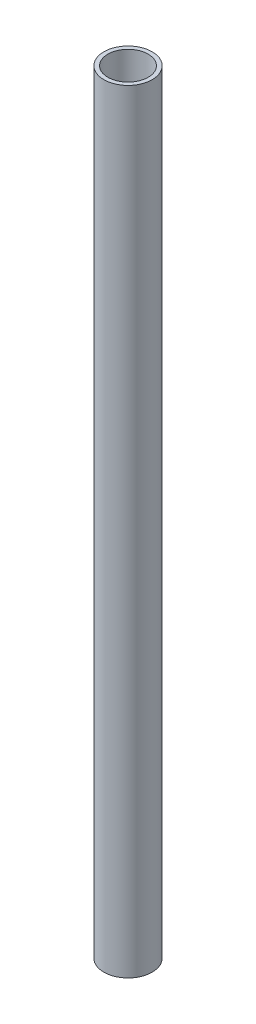
ISO-10303-21;
HEADER;
FILE_DESCRIPTION(('STEP AP214'),'2;1');
FILE_NAME('part.step','',(''),(''),'','','');
FILE_SCHEMA(('AUTOMOTIVE_DESIGN { 1 0 10303 214 1 1 1 1 }'));
ENDSEC;
DATA;
#1=APPLICATION_CONTEXT('core data for automotive mechanical design processes');
#2=APPLICATION_PROTOCOL_DEFINITION('international standard','automotive_design',2000,#1);
#3=PRODUCT_CONTEXT('',#1,'mechanical');
#4=PRODUCT('Part','Part','',(#3));
#5=PRODUCT_RELATED_PRODUCT_CATEGORY('part','',(#4));
#6=PRODUCT_DEFINITION_FORMATION('','',#4);
#7=PRODUCT_DEFINITION_CONTEXT('part definition',#1,'design');
#8=PRODUCT_DEFINITION('design','',#6,#7);
#9=PRODUCT_DEFINITION_SHAPE('','',#8);
#10=(LENGTH_UNIT() NAMED_UNIT(*) SI_UNIT(.MILLI.,.METRE.));
#11=(NAMED_UNIT(*) PLANE_ANGLE_UNIT() SI_UNIT($,.RADIAN.));
#12=(NAMED_UNIT(*) SI_UNIT($,.STERADIAN.) SOLID_ANGLE_UNIT());
#13=UNCERTAINTY_MEASURE_WITH_UNIT(LENGTH_MEASURE(1.E-05),#10,'distance_accuracy_value','');
#14=(GEOMETRIC_REPRESENTATION_CONTEXT(3) GLOBAL_UNCERTAINTY_ASSIGNED_CONTEXT((#13)) GLOBAL_UNIT_ASSIGNED_CONTEXT((#10,
#11,#12)) REPRESENTATION_CONTEXT('',''));
#15=CARTESIAN_POINT('',(0.,0.,0.));
#16=DIRECTION('',(0.,0.,1.));
#17=DIRECTION('',(1.,0.,0.));
#18=AXIS2_PLACEMENT_3D('',#15,#16,#17);
#19=CARTESIAN_POINT('',(0.,304.8,0.));
#20=DIRECTION('',(0.,1.,0.));
#21=DIRECTION('',(0.,0.,1.));
#22=AXIS2_PLACEMENT_3D('',#19,#20,#21);
#23=PLANE('',#22);
#24=CARTESIAN_POINT('',(0.,304.8,0.));
#25=DIRECTION('',(0.,1.,0.));
#26=DIRECTION('',(0.,0.,1.));
#27=AXIS2_PLACEMENT_3D('',#24,#25,#26);
#28=CIRCLE('',#27,9.525);
#29=CARTESIAN_POINT('',(0.,304.8,-9.525));
#30=VERTEX_POINT('',#29);
#31=EDGE_CURVE('E10',#30,#30,#28,.T.);
#32=ORIENTED_EDGE('',*,*,#31,.T.);
#33=EDGE_LOOP('',(#32));
#34=FACE_BOUND('',#33,.T.);
#35=CARTESIAN_POINT('',(0.,304.8,0.));
#36=DIRECTION('',(0.,1.,0.));
#37=DIRECTION('',(0.,0.,1.));
#38=AXIS2_PLACEMENT_3D('',#35,#36,#37);
#39=CIRCLE('',#38,7.9375);
#40=CARTESIAN_POINT('',(0.,304.8,-7.9375));
#41=VERTEX_POINT('',#40);
#42=EDGE_CURVE('E55',#41,#41,#39,.T.);
#43=ORIENTED_EDGE('',*,*,#42,.F.);
#44=EDGE_LOOP('',(#43));
#45=FACE_BOUND('',#44,.T.);
#46=ADVANCED_FACE('F42',(#34,#45),#23,.T.);
#47=CARTESIAN_POINT('',(0.,0.,0.));
#48=DIRECTION('',(0.,1.,0.));
#49=DIRECTION('',(0.,0.,1.));
#50=AXIS2_PLACEMENT_3D('',#47,#48,#49);
#51=PLANE('',#50);
#52=CARTESIAN_POINT('',(0.,0.,0.));
#53=DIRECTION('',(0.,1.,0.));
#54=DIRECTION('',(0.,0.,1.));
#55=AXIS2_PLACEMENT_3D('',#52,#53,#54);
#56=CIRCLE('',#55,9.525);
#57=CARTESIAN_POINT('',(0.,0.,-9.525));
#58=VERTEX_POINT('',#57);
#59=EDGE_CURVE('E46',#58,#58,#56,.T.);
#60=ORIENTED_EDGE('',*,*,#59,.F.);
#61=EDGE_LOOP('',(#60));
#62=FACE_BOUND('',#61,.T.);
#63=CARTESIAN_POINT('',(0.,0.,0.));
#64=DIRECTION('',(0.,1.,0.));
#65=DIRECTION('',(0.,0.,1.));
#66=AXIS2_PLACEMENT_3D('',#63,#64,#65);
#67=CIRCLE('',#66,7.9375);
#68=CARTESIAN_POINT('',(0.,0.,-7.9375));
#69=VERTEX_POINT('',#68);
#70=EDGE_CURVE('E57',#69,#69,#67,.T.);
#71=ORIENTED_EDGE('',*,*,#70,.T.);
#72=EDGE_LOOP('',(#71));
#73=FACE_BOUND('',#72,.T.);
#74=ADVANCED_FACE('F69',(#62,#73),#51,.F.);
#75=CARTESIAN_POINT('',(0.,304.8,0.));
#76=DIRECTION('',(0.,-1.,0.));
#77=DIRECTION('',(0.,0.,-1.));
#78=AXIS2_PLACEMENT_3D('',#75,#76,#77);
#79=CYLINDRICAL_SURFACE('',#78,9.525);
#80=CARTESIAN_POINT('',(0.,304.8,-9.525));
#81=CARTESIAN_POINT('',(0.,301.625,-9.525));
#82=CARTESIAN_POINT('',(0.,298.45,-9.525));
#83=CARTESIAN_POINT('',(0.,292.1,-9.525));
#84=CARTESIAN_POINT('',(0.,288.925,-9.525));
#85=CARTESIAN_POINT('',(0.,282.575,-9.525));
#86=CARTESIAN_POINT('',(0.,279.4,-9.525));
#87=CARTESIAN_POINT('',(0.,273.05,-9.525));
#88=CARTESIAN_POINT('',(0.,269.875,-9.525));
#89=CARTESIAN_POINT('',(0.,263.525,-9.525));
#90=CARTESIAN_POINT('',(0.,260.35,-9.525));
#91=CARTESIAN_POINT('',(0.,254.,-9.525));
#92=CARTESIAN_POINT('',(0.,250.825,-9.525));
#93=CARTESIAN_POINT('',(0.,244.475,-9.525));
#94=CARTESIAN_POINT('',(0.,241.3,-9.525));
#95=CARTESIAN_POINT('',(0.,234.95,-9.525));
#96=CARTESIAN_POINT('',(0.,231.775,-9.525));
#97=CARTESIAN_POINT('',(0.,225.425,-9.525));
#98=CARTESIAN_POINT('',(0.,222.25,-9.525));
#99=CARTESIAN_POINT('',(0.,215.9,-9.525));
#100=CARTESIAN_POINT('',(0.,212.725,-9.525));
#101=CARTESIAN_POINT('',(0.,206.375,-9.525));
#102=CARTESIAN_POINT('',(0.,203.2,-9.525));
#103=CARTESIAN_POINT('',(0.,196.85,-9.525));
#104=CARTESIAN_POINT('',(0.,193.675,-9.525));
#105=CARTESIAN_POINT('',(0.,187.325,-9.525));
#106=CARTESIAN_POINT('',(0.,184.15,-9.525));
#107=CARTESIAN_POINT('',(0.,177.8,-9.525));
#108=CARTESIAN_POINT('',(0.,174.625,-9.525));
#109=CARTESIAN_POINT('',(0.,168.275,-9.525));
#110=CARTESIAN_POINT('',(0.,165.1,-9.525));
#111=CARTESIAN_POINT('',(0.,158.75,-9.525));
#112=CARTESIAN_POINT('',(0.,155.575,-9.525));
#113=CARTESIAN_POINT('',(0.,149.225,-9.525));
#114=CARTESIAN_POINT('',(0.,146.05,-9.525));
#115=CARTESIAN_POINT('',(0.,139.7,-9.525));
#116=CARTESIAN_POINT('',(0.,136.525,-9.525));
#117=CARTESIAN_POINT('',(0.,130.175,-9.525));
#118=CARTESIAN_POINT('',(0.,127.,-9.525));
#119=CARTESIAN_POINT('',(0.,120.65,-9.525));
#120=CARTESIAN_POINT('',(0.,117.475,-9.525));
#121=CARTESIAN_POINT('',(0.,111.125,-9.525));
#122=CARTESIAN_POINT('',(0.,107.95,-9.525));
#123=CARTESIAN_POINT('',(0.,101.6,-9.525));
#124=CARTESIAN_POINT('',(0.,98.425,-9.525));
#125=CARTESIAN_POINT('',(0.,92.075,-9.525));
#126=CARTESIAN_POINT('',(0.,88.9,-9.525));
#127=CARTESIAN_POINT('',(0.,82.55,-9.525));
#128=CARTESIAN_POINT('',(0.,79.375,-9.525));
#129=CARTESIAN_POINT('',(0.,73.025,-9.525));
#130=CARTESIAN_POINT('',(0.,69.85,-9.525));
#131=CARTESIAN_POINT('',(0.,63.5,-9.525));
#132=CARTESIAN_POINT('',(0.,60.325,-9.525));
#133=CARTESIAN_POINT('',(0.,53.975,-9.525));
#134=CARTESIAN_POINT('',(0.,50.8,-9.525));
#135=CARTESIAN_POINT('',(0.,44.45,-9.525));
#136=CARTESIAN_POINT('',(0.,41.275,-9.525));
#137=CARTESIAN_POINT('',(0.,34.925,-9.525));
#138=CARTESIAN_POINT('',(0.,31.75,-9.525));
#139=CARTESIAN_POINT('',(0.,25.4,-9.525));
#140=CARTESIAN_POINT('',(0.,22.225,-9.525));
#141=CARTESIAN_POINT('',(0.,15.875,-9.525));
#142=CARTESIAN_POINT('',(0.,12.7,-9.525));
#143=CARTESIAN_POINT('',(0.,6.35,-9.525));
#144=CARTESIAN_POINT('',(0.,3.175,-9.525));
#145=CARTESIAN_POINT('',(0.,0.,-9.525));
#146=B_SPLINE_CURVE_WITH_KNOTS('',3,(#80,#81,#82,#83,#84,#85,#86,#87,#88,#89,#90,#91,#92,#93,
#94,#95,#96,#97,#98,#99,#100,#101,#102,#103,#104,#105,#106,#107,#108,#109,#110,#111,#112,#113,
#114,#115,#116,#117,#118,#119,#120,#121,#122,#123,#124,#125,#126,#127,#128,#129,#130,#131,#132,
#133,#134,#135,#136,#137,#138,#139,#140,#141,#142,#143,#144,#145),.UNSPECIFIED.,.F.,.F.,(4,2,2,
2,2,2,2,2,2,2,2,2,2,2,2,2,2,2,2,2,2,2,2,2,2,2,2,2,2,2,2,2,4),(0.,9.52499999999995,19.05,28.575,
38.1,47.625,57.15,66.675,76.2,85.725,95.2499999999999,104.775,114.3,123.825,133.35,142.875,
152.4,161.925,171.45,180.975,190.5,200.025,209.55,219.075,228.6,238.125,247.65,257.175,266.7,
276.225,285.75,295.275,304.8),.UNSPECIFIED.);
#147=EDGE_CURVE('BSEAM44',#30,#58,#146,.T.);
#148=ORIENTED_EDGE('',*,*,#31,.F.);
#149=ORIENTED_EDGE('',*,*,#59,.T.);
#150=ORIENTED_EDGE('',*,*,#147,.T.);
#151=ORIENTED_EDGE('',*,*,#147,.F.);
#152=EDGE_LOOP('',(#148,#150,#149,#151));
#153=FACE_BOUND('',#152,.T.);
#154=ADVANCED_FACE('F44',(#153),#79,.T.);
#155=CARTESIAN_POINT('',(0.,304.8,0.));
#156=DIRECTION('',(0.,-1.,0.));
#157=DIRECTION('',(0.,0.,-1.));
#158=AXIS2_PLACEMENT_3D('',#155,#156,#157);
#159=CYLINDRICAL_SURFACE('',#158,7.9375);
#160=CARTESIAN_POINT('',(0.,304.8,-7.9375));
#161=CARTESIAN_POINT('',(0.,301.625,-7.9375));
#162=CARTESIAN_POINT('',(0.,298.45,-7.9375));
#163=CARTESIAN_POINT('',(0.,292.1,-7.9375));
#164=CARTESIAN_POINT('',(0.,288.925,-7.9375));
#165=CARTESIAN_POINT('',(0.,282.575,-7.9375));
#166=CARTESIAN_POINT('',(0.,279.4,-7.9375));
#167=CARTESIAN_POINT('',(0.,273.05,-7.9375));
#168=CARTESIAN_POINT('',(0.,269.875,-7.9375));
#169=CARTESIAN_POINT('',(0.,263.525,-7.9375));
#170=CARTESIAN_POINT('',(0.,260.35,-7.9375));
#171=CARTESIAN_POINT('',(0.,254.,-7.9375));
#172=CARTESIAN_POINT('',(0.,250.825,-7.9375));
#173=CARTESIAN_POINT('',(0.,244.475,-7.9375));
#174=CARTESIAN_POINT('',(0.,241.3,-7.9375));
#175=CARTESIAN_POINT('',(0.,234.95,-7.9375));
#176=CARTESIAN_POINT('',(0.,231.775,-7.9375));
#177=CARTESIAN_POINT('',(0.,225.425,-7.9375));
#178=CARTESIAN_POINT('',(0.,222.25,-7.9375));
#179=CARTESIAN_POINT('',(0.,215.9,-7.9375));
#180=CARTESIAN_POINT('',(0.,212.725,-7.9375));
#181=CARTESIAN_POINT('',(0.,206.375,-7.9375));
#182=CARTESIAN_POINT('',(0.,203.2,-7.9375));
#183=CARTESIAN_POINT('',(0.,196.85,-7.9375));
#184=CARTESIAN_POINT('',(0.,193.675,-7.9375));
#185=CARTESIAN_POINT('',(0.,187.325,-7.9375));
#186=CARTESIAN_POINT('',(0.,184.15,-7.9375));
#187=CARTESIAN_POINT('',(0.,177.8,-7.9375));
#188=CARTESIAN_POINT('',(0.,174.625,-7.9375));
#189=CARTESIAN_POINT('',(0.,168.275,-7.9375));
#190=CARTESIAN_POINT('',(0.,165.1,-7.9375));
#191=CARTESIAN_POINT('',(0.,158.75,-7.9375));
#192=CARTESIAN_POINT('',(0.,155.575,-7.9375));
#193=CARTESIAN_POINT('',(0.,149.225,-7.9375));
#194=CARTESIAN_POINT('',(0.,146.05,-7.9375));
#195=CARTESIAN_POINT('',(0.,139.7,-7.9375));
#196=CARTESIAN_POINT('',(0.,136.525,-7.9375));
#197=CARTESIAN_POINT('',(0.,130.175,-7.9375));
#198=CARTESIAN_POINT('',(0.,127.,-7.9375));
#199=CARTESIAN_POINT('',(0.,120.65,-7.9375));
#200=CARTESIAN_POINT('',(0.,117.475,-7.9375));
#201=CARTESIAN_POINT('',(0.,111.125,-7.9375));
#202=CARTESIAN_POINT('',(0.,107.95,-7.9375));
#203=CARTESIAN_POINT('',(0.,101.6,-7.9375));
#204=CARTESIAN_POINT('',(0.,98.425,-7.9375));
#205=CARTESIAN_POINT('',(0.,92.075,-7.9375));
#206=CARTESIAN_POINT('',(0.,88.9,-7.9375));
#207=CARTESIAN_POINT('',(0.,82.55,-7.9375));
#208=CARTESIAN_POINT('',(0.,79.375,-7.9375));
#209=CARTESIAN_POINT('',(0.,73.025,-7.9375));
#210=CARTESIAN_POINT('',(0.,69.85,-7.9375));
#211=CARTESIAN_POINT('',(0.,63.5,-7.9375));
#212=CARTESIAN_POINT('',(0.,60.325,-7.9375));
#213=CARTESIAN_POINT('',(0.,53.975,-7.9375));
#214=CARTESIAN_POINT('',(0.,50.8,-7.9375));
#215=CARTESIAN_POINT('',(0.,44.45,-7.9375));
#216=CARTESIAN_POINT('',(0.,41.275,-7.9375));
#217=CARTESIAN_POINT('',(0.,34.925,-7.9375));
#218=CARTESIAN_POINT('',(0.,31.75,-7.9375));
#219=CARTESIAN_POINT('',(0.,25.4,-7.9375));
#220=CARTESIAN_POINT('',(0.,22.225,-7.9375));
#221=CARTESIAN_POINT('',(0.,15.875,-7.9375));
#222=CARTESIAN_POINT('',(0.,12.7,-7.9375));
#223=CARTESIAN_POINT('',(0.,6.35,-7.9375));
#224=CARTESIAN_POINT('',(0.,3.175,-7.9375));
#225=CARTESIAN_POINT('',(0.,0.,-7.9375));
#226=B_SPLINE_CURVE_WITH_KNOTS('',3,(#160,#161,#162,#163,#164,#165,#166,#167,#168,#169,#170,
#171,#172,#173,#174,#175,#176,#177,#178,#179,#180,#181,#182,#183,#184,#185,#186,#187,#188,#189,
#190,#191,#192,#193,#194,#195,#196,#197,#198,#199,#200,#201,#202,#203,#204,#205,#206,#207,#208,
#209,#210,#211,#212,#213,#214,#215,#216,#217,#218,#219,#220,#221,#222,#223,#224,#225),
.UNSPECIFIED.,.F.,.F.,(4,2,2,2,2,2,2,2,2,2,2,2,2,2,2,2,2,2,2,2,2,2,2,2,2,2,2,2,2,2,2,2,4),(0.,
9.52500000000001,19.05,28.575,38.1,47.625,57.15,66.675,76.2,85.7250000000001,95.2500000000001,
104.775,114.3,123.825,133.35,142.875,152.4,161.925,171.45,180.975,190.5,200.025,209.55,219.075,
228.6,238.125,247.65,257.175,266.7,276.225,285.75,295.275,304.8),.UNSPECIFIED.);
#227=EDGE_CURVE('BSEAM65',#41,#69,#226,.T.);
#228=ORIENTED_EDGE('',*,*,#42,.T.);
#229=ORIENTED_EDGE('',*,*,#70,.F.);
#230=ORIENTED_EDGE('',*,*,#227,.T.);
#231=ORIENTED_EDGE('',*,*,#227,.F.);
#232=EDGE_LOOP('',(#228,#230,#229,#231));
#233=FACE_BOUND('',#232,.T.);
#234=ADVANCED_FACE('F65',(#233),#159,.F.);
#235=CLOSED_SHELL('',(#46,#74,#154,#234));
#236=MANIFOLD_SOLID_BREP('B2',#235);
#237=ADVANCED_BREP_SHAPE_REPRESENTATION('',(#18,#236),#14);
#238=SHAPE_DEFINITION_REPRESENTATION(#9,#237);
ENDSEC;
END-ISO-10303-21;
